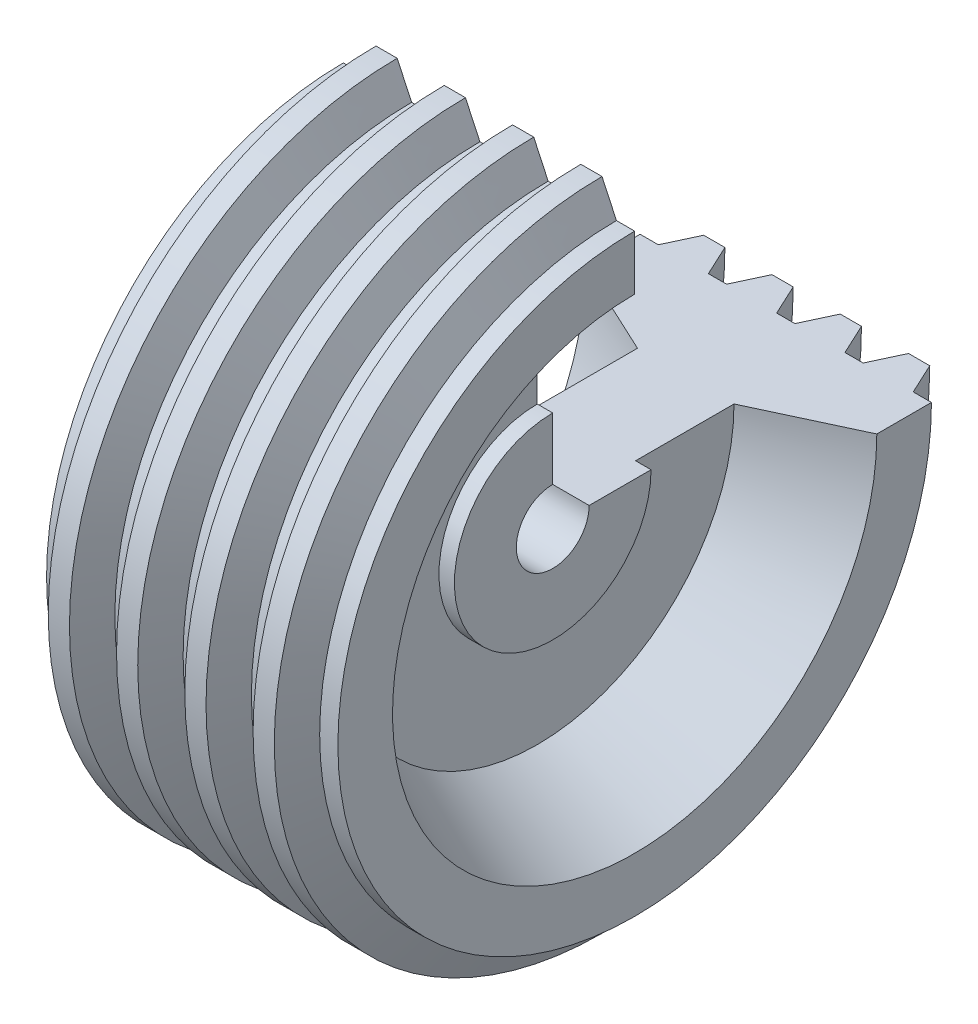
ISO-10303-21;
HEADER;
FILE_DESCRIPTION(('STEP AP214'),'2;1');
FILE_NAME('part.step','',(''),(''),'','','');
FILE_SCHEMA(('AUTOMOTIVE_DESIGN { 1 0 10303 214 1 1 1 1 }'));
ENDSEC;
DATA;
#1=APPLICATION_CONTEXT('core data for automotive mechanical design processes');
#2=APPLICATION_PROTOCOL_DEFINITION('international standard','automotive_design',2000,#1);
#3=PRODUCT_CONTEXT('',#1,'mechanical');
#4=PRODUCT('Part','Part','',(#3));
#5=PRODUCT_RELATED_PRODUCT_CATEGORY('part','',(#4));
#6=PRODUCT_DEFINITION_FORMATION('','',#4);
#7=PRODUCT_DEFINITION_CONTEXT('part definition',#1,'design');
#8=PRODUCT_DEFINITION('design','',#6,#7);
#9=PRODUCT_DEFINITION_SHAPE('','',#8);
#10=(LENGTH_UNIT() NAMED_UNIT(*) SI_UNIT(.MILLI.,.METRE.));
#11=(NAMED_UNIT(*) PLANE_ANGLE_UNIT() SI_UNIT($,.RADIAN.));
#12=(NAMED_UNIT(*) SI_UNIT($,.STERADIAN.) SOLID_ANGLE_UNIT());
#13=UNCERTAINTY_MEASURE_WITH_UNIT(LENGTH_MEASURE(1.E-05),#10,'distance_accuracy_value','');
#14=(GEOMETRIC_REPRESENTATION_CONTEXT(3) GLOBAL_UNCERTAINTY_ASSIGNED_CONTEXT((#13)) GLOBAL_UNIT_ASSIGNED_CONTEXT((#10,
#11,#12)) REPRESENTATION_CONTEXT('',''));
#15=CARTESIAN_POINT('',(0.,0.,0.));
#16=DIRECTION('',(0.,0.,1.));
#17=DIRECTION('',(1.,0.,0.));
#18=AXIS2_PLACEMENT_3D('',#15,#16,#17);
#19=CARTESIAN_POINT('',(-35.,2.09488880330588E-13,-20.));
#20=DIRECTION('',(1.,0.,0.));
#21=DIRECTION('',(0.,0.,-1.));
#22=AXIS2_PLACEMENT_3D('',#19,#20,#21);
#23=PLANE('',#22);
#24=CARTESIAN_POINT('',(-35.,0.,0.));
#25=DIRECTION('',(-1.,0.,0.));
#26=DIRECTION('',(0.,0.,1.));
#27=AXIS2_PLACEMENT_3D('',#24,#25,#26);
#28=CIRCLE('',#27,54.);
#29=CARTESIAN_POINT('',(-35.,5.65619976892588E-13,-54.));
#30=VERTEX_POINT('',#29);
#31=CARTESIAN_POINT('',(-35.,54.,0.));
#32=VERTEX_POINT('',#31);
#33=EDGE_CURVE('E11',#30,#32,#28,.T.);
#34=ORIENTED_EDGE('',*,*,#33,.T.);
#35=DIRECTION('',(0.,-1.,0.));
#36=VECTOR('',#35,1.);
#37=CARTESIAN_POINT('',(-35.,20.,0.));
#38=LINE('',#37,#36);
#39=CARTESIAN_POINT('',(-35.,20.,0.));
#40=VERTEX_POINT('',#39);
#41=EDGE_CURVE('E239',#32,#40,#38,.T.);
#42=ORIENTED_EDGE('',*,*,#41,.T.);
#43=CARTESIAN_POINT('',(-35.,0.,0.));
#44=DIRECTION('',(-1.,0.,0.));
#45=DIRECTION('',(0.,0.,1.));
#46=AXIS2_PLACEMENT_3D('',#43,#44,#45);
#47=CIRCLE('',#46,20.);
#48=CARTESIAN_POINT('',(-35.,2.09488880330588E-13,-20.));
#49=VERTEX_POINT('',#48);
#50=EDGE_CURVE('E221',#49,#40,#47,.T.);
#51=ORIENTED_EDGE('',*,*,#50,.F.);
#52=DIRECTION('',(0.,0.,1.));
#53=VECTOR('',#52,1.);
#54=CARTESIAN_POINT('',(-35.,2.09488880330588E-13,-20.));
#55=LINE('',#54,#53);
#56=EDGE_CURVE('E320',#30,#49,#55,.T.);
#57=ORIENTED_EDGE('',*,*,#56,.F.);
#58=EDGE_LOOP('',(#34,#42,#51,#57));
#59=FACE_BOUND('',#58,.T.);
#60=ADVANCED_FACE('F37',(#59),#23,.F.);
#61=CARTESIAN_POINT('',(0.,0.,0.));
#62=DIRECTION('',(-1.,0.,0.));
#63=DIRECTION('',(0.,0.,1.));
#64=AXIS2_PLACEMENT_3D('',#61,#62,#63);
#65=CYLINDRICAL_SURFACE('',#64,54.);
#66=CARTESIAN_POINT('',(-26.5,0.,0.));
#67=DIRECTION('',(-1.,0.,0.));
#68=DIRECTION('',(0.,0.,1.));
#69=AXIS2_PLACEMENT_3D('',#66,#67,#68);
#70=CIRCLE('',#69,54.);
#71=CARTESIAN_POINT('',(-26.5,5.65619976892588E-13,-54.));
#72=VERTEX_POINT('',#71);
#73=CARTESIAN_POINT('',(-26.5,54.,0.));
#74=VERTEX_POINT('',#73);
#75=EDGE_CURVE('E45',#72,#74,#70,.T.);
#76=ORIENTED_EDGE('',*,*,#75,.T.);
#77=DIRECTION('',(-1.,0.,0.));
#78=VECTOR('',#77,1.);
#79=CARTESIAN_POINT('',(-35.,54.,0.));
#80=LINE('',#79,#78);
#81=EDGE_CURVE('E318',#74,#32,#80,.T.);
#82=ORIENTED_EDGE('',*,*,#81,.T.);
#83=ORIENTED_EDGE('',*,*,#33,.F.);
#84=DIRECTION('',(-1.,0.,0.));
#85=VECTOR('',#84,1.);
#86=CARTESIAN_POINT('',(-35.,5.65619976892588E-13,-54.));
#87=LINE('',#86,#85);
#88=EDGE_CURVE('E233',#72,#30,#87,.T.);
#89=ORIENTED_EDGE('',*,*,#88,.F.);
#90=EDGE_LOOP('',(#76,#82,#83,#89));
#91=FACE_BOUND('',#90,.T.);
#92=ADVANCED_FACE('F39',(#91),#65,.T.);
#93=CARTESIAN_POINT('',(-26.5,5.65619976892588E-13,-54.));
#94=DIRECTION('',(1.,0.,0.));
#95=DIRECTION('',(0.,0.,-1.));
#96=AXIS2_PLACEMENT_3D('',#93,#94,#95);
#97=PLANE('',#96);
#98=CARTESIAN_POINT('',(-26.5,0.,0.));
#99=DIRECTION('',(-1.,0.,0.));
#100=DIRECTION('',(0.,0.,1.));
#101=AXIS2_PLACEMENT_3D('',#98,#99,#100);
#102=CIRCLE('',#101,108.052540288708);
#103=CARTESIAN_POINT('',(-26.5,1.13179028409786E-12,-108.052540288708));
#104=VERTEX_POINT('',#103);
#105=CARTESIAN_POINT('',(-26.5,108.052540288708,0.));
#106=VERTEX_POINT('',#105);
#107=EDGE_CURVE('E445',#104,#106,#102,.T.);
#108=ORIENTED_EDGE('',*,*,#107,.T.);
#109=DIRECTION('',(0.,-1.,0.));
#110=VECTOR('',#109,1.);
#111=CARTESIAN_POINT('',(-26.5,54.,0.));
#112=LINE('',#111,#110);
#113=EDGE_CURVE('E316',#106,#74,#112,.T.);
#114=ORIENTED_EDGE('',*,*,#113,.T.);
#115=ORIENTED_EDGE('',*,*,#75,.F.);
#116=DIRECTION('',(0.,0.,1.));
#117=VECTOR('',#116,1.);
#118=CARTESIAN_POINT('',(-26.5,5.65619976892588E-13,-54.));
#119=LINE('',#118,#117);
#120=EDGE_CURVE('E395',#104,#72,#119,.T.);
#121=ORIENTED_EDGE('',*,*,#120,.F.);
#122=EDGE_LOOP('',(#108,#114,#115,#121));
#123=FACE_BOUND('',#122,.T.);
#124=ADVANCED_FACE('F447',(#123),#97,.F.);
#125=CARTESIAN_POINT('',(-80.,0.,0.));
#126=DIRECTION('',(-1.,0.,0.));
#127=DIRECTION('',(0.,0.,1.));
#128=AXIS2_PLACEMENT_3D('',#125,#126,#127);
#129=CONICAL_SURFACE('',#128,133.,0.43633231299858);
#130=CARTESIAN_POINT('',(-80.,0.,0.));
#131=DIRECTION('',(-1.,0.,0.));
#132=DIRECTION('',(0.,0.,1.));
#133=AXIS2_PLACEMENT_3D('',#130,#131,#132);
#134=CIRCLE('',#133,133.);
#135=CARTESIAN_POINT('',(-80.,1.39310105419841E-12,-133.));
#136=VERTEX_POINT('',#135);
#137=CARTESIAN_POINT('',(-80.,133.,0.));
#138=VERTEX_POINT('',#137);
#139=EDGE_CURVE('E443',#136,#138,#134,.T.);
#140=ORIENTED_EDGE('',*,*,#139,.T.);
#141=DIRECTION('',(0.906307787036651,-0.422618261740697,0.));
#142=VECTOR('',#141,1.);
#143=CARTESIAN_POINT('',(-26.5,108.052540288708,0.));
#144=LINE('',#143,#142);
#145=EDGE_CURVE('E313',#138,#106,#144,.T.);
#146=ORIENTED_EDGE('',*,*,#145,.T.);
#147=ORIENTED_EDGE('',*,*,#107,.F.);
#148=DIRECTION('',(0.906307787036651,0.,0.422618261740697));
#149=VECTOR('',#148,1.);
#150=CARTESIAN_POINT('',(-26.5,1.13179028409786E-12,-108.052540288708));
#151=LINE('',#150,#149);
#152=EDGE_CURVE('E392',#136,#104,#151,.T.);
#153=ORIENTED_EDGE('',*,*,#152,.F.);
#154=EDGE_LOOP('',(#140,#146,#147,#153));
#155=FACE_BOUND('',#154,.T.);
#156=ADVANCED_FACE('F452',(#155),#129,.F.);
#157=CARTESIAN_POINT('',(-80.,1.39310105419841E-12,-133.));
#158=DIRECTION('',(1.,0.,0.));
#159=DIRECTION('',(0.,0.,-1.));
#160=AXIS2_PLACEMENT_3D('',#157,#158,#159);
#161=PLANE('',#160);
#162=CARTESIAN_POINT('',(-80.,0.,0.));
#163=DIRECTION('',(-1.,0.,0.));
#164=DIRECTION('',(0.,0.,1.));
#165=AXIS2_PLACEMENT_3D('',#162,#163,#164);
#166=CIRCLE('',#165,163.);
#167=CARTESIAN_POINT('',(-80.,1.70733437469429E-12,-163.));
#168=VERTEX_POINT('',#167);
#169=CARTESIAN_POINT('',(-80.,163.,0.));
#170=VERTEX_POINT('',#169);
#171=EDGE_CURVE('E441',#168,#170,#166,.T.);
#172=ORIENTED_EDGE('',*,*,#171,.T.);
#173=DIRECTION('',(0.,-1.,0.));
#174=VECTOR('',#173,1.);
#175=CARTESIAN_POINT('',(-80.,133.,0.));
#176=LINE('',#175,#174);
#177=EDGE_CURVE('E310',#170,#138,#176,.T.);
#178=ORIENTED_EDGE('',*,*,#177,.T.);
#179=ORIENTED_EDGE('',*,*,#139,.F.);
#180=DIRECTION('',(0.,0.,1.));
#181=VECTOR('',#180,1.);
#182=CARTESIAN_POINT('',(-80.,1.39310105419841E-12,-133.));
#183=LINE('',#182,#181);
#184=EDGE_CURVE('E389',#168,#136,#183,.T.);
#185=ORIENTED_EDGE('',*,*,#184,.F.);
#186=EDGE_LOOP('',(#172,#178,#179,#185));
#187=FACE_BOUND('',#186,.T.);
#188=ADVANCED_FACE('F456',(#187),#161,.F.);
#189=CARTESIAN_POINT('',(0.,0.,0.));
#190=DIRECTION('',(-1.,0.,0.));
#191=DIRECTION('',(0.,0.,1.));
#192=AXIS2_PLACEMENT_3D('',#189,#190,#191);
#193=CYLINDRICAL_SURFACE('',#192,163.);
#194=CARTESIAN_POINT('',(-70.,0.,0.));
#195=DIRECTION('',(-1.,0.,0.));
#196=DIRECTION('',(0.,0.,1.));
#197=AXIS2_PLACEMENT_3D('',#194,#195,#196);
#198=CIRCLE('',#197,163.);
#199=CARTESIAN_POINT('',(-70.,1.70733437469429E-12,-163.));
#200=VERTEX_POINT('',#199);
#201=CARTESIAN_POINT('',(-70.,163.,0.));
#202=VERTEX_POINT('',#201);
#203=EDGE_CURVE('E439',#200,#202,#198,.T.);
#204=ORIENTED_EDGE('',*,*,#203,.T.);
#205=DIRECTION('',(-1.,0.,0.));
#206=VECTOR('',#205,1.);
#207=CARTESIAN_POINT('',(-80.,163.,0.));
#208=LINE('',#207,#206);
#209=EDGE_CURVE('E307',#202,#170,#208,.T.);
#210=ORIENTED_EDGE('',*,*,#209,.T.);
#211=ORIENTED_EDGE('',*,*,#171,.F.);
#212=DIRECTION('',(-1.,0.,0.));
#213=VECTOR('',#212,1.);
#214=CARTESIAN_POINT('',(-80.,1.70733437469429E-12,-163.));
#215=LINE('',#214,#213);
#216=EDGE_CURVE('E386',#200,#168,#215,.T.);
#217=ORIENTED_EDGE('',*,*,#216,.F.);
#218=EDGE_LOOP('',(#204,#210,#211,#217));
#219=FACE_BOUND('',#218,.T.);
#220=ADVANCED_FACE('F459',(#219),#193,.T.);
#221=CARTESIAN_POINT('',(-62.0727698113651,0.,0.));
#222=DIRECTION('',(1.,0.,0.));
#223=DIRECTION('',(0.,0.,-1.));
#224=AXIS2_PLACEMENT_3D('',#221,#222,#223);
#225=CONICAL_SURFACE('',#224,180.,1.13446401379632);
#226=CARTESIAN_POINT('',(-62.0727698113651,0.,0.));
#227=DIRECTION('',(-1.,0.,0.));
#228=DIRECTION('',(0.,0.,1.));
#229=AXIS2_PLACEMENT_3D('',#226,#227,#228);
#230=CIRCLE('',#229,180.);
#231=CARTESIAN_POINT('',(-62.0727698113651,1.88539992297529E-12,-180.));
#232=VERTEX_POINT('',#231);
#233=CARTESIAN_POINT('',(-62.0727698113651,180.,0.));
#234=VERTEX_POINT('',#233);
#235=EDGE_CURVE('E437',#232,#234,#230,.T.);
#236=ORIENTED_EDGE('',*,*,#235,.T.);
#237=DIRECTION('',(-0.422618261740697,-0.906307787036651,0.));
#238=VECTOR('',#237,1.);
#239=CARTESIAN_POINT('',(-70.,163.,0.));
#240=LINE('',#239,#238);
#241=EDGE_CURVE('E304',#234,#202,#240,.T.);
#242=ORIENTED_EDGE('',*,*,#241,.T.);
#243=ORIENTED_EDGE('',*,*,#203,.F.);
#244=DIRECTION('',(-0.422618261740697,0.,0.906307787036651));
#245=VECTOR('',#244,1.);
#246=CARTESIAN_POINT('',(-70.,1.70733437469429E-12,-163.));
#247=LINE('',#246,#245);
#248=EDGE_CURVE('E383',#232,#200,#247,.T.);
#249=ORIENTED_EDGE('',*,*,#248,.F.);
#250=EDGE_LOOP('',(#236,#242,#243,#249));
#251=FACE_BOUND('',#250,.T.);
#252=ADVANCED_FACE('F464',(#251),#225,.T.);
#253=CARTESIAN_POINT('',(0.,0.,0.));
#254=DIRECTION('',(-1.,0.,0.));
#255=DIRECTION('',(0.,0.,1.));
#256=AXIS2_PLACEMENT_3D('',#253,#254,#255);
#257=CYLINDRICAL_SURFACE('',#256,180.);
#258=CARTESIAN_POINT('',(-50.4272301886349,0.,0.));
#259=DIRECTION('',(-1.,0.,0.));
#260=DIRECTION('',(0.,0.,1.));
#261=AXIS2_PLACEMENT_3D('',#258,#259,#260);
#262=CIRCLE('',#261,180.);
#263=CARTESIAN_POINT('',(-50.4272301886349,1.88539992297529E-12,-180.));
#264=VERTEX_POINT('',#263);
#265=CARTESIAN_POINT('',(-50.4272301886349,180.,0.));
#266=VERTEX_POINT('',#265);
#267=EDGE_CURVE('E435',#264,#266,#262,.T.);
#268=ORIENTED_EDGE('',*,*,#267,.T.);
#269=DIRECTION('',(-1.,0.,0.));
#270=VECTOR('',#269,1.);
#271=CARTESIAN_POINT('',(-62.0727698113651,180.,0.));
#272=LINE('',#271,#270);
#273=EDGE_CURVE('E301',#266,#234,#272,.T.);
#274=ORIENTED_EDGE('',*,*,#273,.T.);
#275=ORIENTED_EDGE('',*,*,#235,.F.);
#276=DIRECTION('',(-1.,0.,0.));
#277=VECTOR('',#276,1.);
#278=CARTESIAN_POINT('',(-62.0727698113651,1.88539992297529E-12,-180.));
#279=LINE('',#278,#277);
#280=EDGE_CURVE('E380',#264,#232,#279,.T.);
#281=ORIENTED_EDGE('',*,*,#280,.F.);
#282=EDGE_LOOP('',(#268,#274,#275,#281));
#283=FACE_BOUND('',#282,.T.);
#284=ADVANCED_FACE('F468',(#283),#257,.T.);
#285=CARTESIAN_POINT('',(-42.5,0.,0.));
#286=DIRECTION('',(-1.,0.,0.));
#287=DIRECTION('',(0.,0.,1.));
#288=AXIS2_PLACEMENT_3D('',#285,#286,#287);
#289=CONICAL_SURFACE('',#288,163.,1.13446401379632);
#290=CARTESIAN_POINT('',(-42.5,0.,0.));
#291=DIRECTION('',(-1.,0.,0.));
#292=DIRECTION('',(0.,0.,1.));
#293=AXIS2_PLACEMENT_3D('',#290,#291,#292);
#294=CIRCLE('',#293,163.);
#295=CARTESIAN_POINT('',(-42.5,1.70733437469429E-12,-163.));
#296=VERTEX_POINT('',#295);
#297=CARTESIAN_POINT('',(-42.5,163.,0.));
#298=VERTEX_POINT('',#297);
#299=EDGE_CURVE('E433',#296,#298,#294,.T.);
#300=ORIENTED_EDGE('',*,*,#299,.T.);
#301=DIRECTION('',(-0.422618261740697,0.906307787036651,0.));
#302=VECTOR('',#301,1.);
#303=CARTESIAN_POINT('',(-50.4272301886349,180.,0.));
#304=LINE('',#303,#302);
#305=EDGE_CURVE('E298',#298,#266,#304,.T.);
#306=ORIENTED_EDGE('',*,*,#305,.T.);
#307=ORIENTED_EDGE('',*,*,#267,.F.);
#308=DIRECTION('',(-0.422618261740697,0.,-0.906307787036651));
#309=VECTOR('',#308,1.);
#310=CARTESIAN_POINT('',(-50.4272301886349,1.88539992297529E-12,-180.));
#311=LINE('',#310,#309);
#312=EDGE_CURVE('E377',#296,#264,#311,.T.);
#313=ORIENTED_EDGE('',*,*,#312,.F.);
#314=EDGE_LOOP('',(#300,#306,#307,#313));
#315=FACE_BOUND('',#314,.T.);
#316=ADVANCED_FACE('F471',(#315),#289,.T.);
#317=CARTESIAN_POINT('',(0.,0.,0.));
#318=DIRECTION('',(-1.,0.,0.));
#319=DIRECTION('',(0.,0.,1.));
#320=AXIS2_PLACEMENT_3D('',#317,#318,#319);
#321=CYLINDRICAL_SURFACE('',#320,163.);
#322=CARTESIAN_POINT('',(-32.5,0.,0.));
#323=DIRECTION('',(-1.,0.,0.));
#324=DIRECTION('',(0.,0.,1.));
#325=AXIS2_PLACEMENT_3D('',#322,#323,#324);
#326=CIRCLE('',#325,163.);
#327=CARTESIAN_POINT('',(-32.5,1.70733437469429E-12,-163.));
#328=VERTEX_POINT('',#327);
#329=CARTESIAN_POINT('',(-32.5,163.,0.));
#330=VERTEX_POINT('',#329);
#331=EDGE_CURVE('E431',#328,#330,#326,.T.);
#332=ORIENTED_EDGE('',*,*,#331,.T.);
#333=DIRECTION('',(-1.,0.,0.));
#334=VECTOR('',#333,1.);
#335=CARTESIAN_POINT('',(-42.5,163.,0.));
#336=LINE('',#335,#334);
#337=EDGE_CURVE('E295',#330,#298,#336,.T.);
#338=ORIENTED_EDGE('',*,*,#337,.T.);
#339=ORIENTED_EDGE('',*,*,#299,.F.);
#340=DIRECTION('',(-1.,0.,0.));
#341=VECTOR('',#340,1.);
#342=CARTESIAN_POINT('',(-42.5,1.70733437469429E-12,-163.));
#343=LINE('',#342,#341);
#344=EDGE_CURVE('E374',#328,#296,#343,.T.);
#345=ORIENTED_EDGE('',*,*,#344,.F.);
#346=EDGE_LOOP('',(#332,#338,#339,#345));
#347=FACE_BOUND('',#346,.T.);
#348=ADVANCED_FACE('F476',(#347),#321,.T.);
#349=CARTESIAN_POINT('',(-24.5727698113651,0.,0.));
#350=DIRECTION('',(1.,0.,0.));
#351=DIRECTION('',(0.,0.,-1.));
#352=AXIS2_PLACEMENT_3D('',#349,#350,#351);
#353=CONICAL_SURFACE('',#352,180.,1.13446401379632);
#354=CARTESIAN_POINT('',(-24.5727698113651,0.,0.));
#355=DIRECTION('',(-1.,0.,0.));
#356=DIRECTION('',(0.,0.,1.));
#357=AXIS2_PLACEMENT_3D('',#354,#355,#356);
#358=CIRCLE('',#357,180.);
#359=CARTESIAN_POINT('',(-24.5727698113651,1.88539992297529E-12,-180.));
#360=VERTEX_POINT('',#359);
#361=CARTESIAN_POINT('',(-24.5727698113651,180.,0.));
#362=VERTEX_POINT('',#361);
#363=EDGE_CURVE('E429',#360,#362,#358,.T.);
#364=ORIENTED_EDGE('',*,*,#363,.T.);
#365=DIRECTION('',(-0.422618261740697,-0.906307787036651,0.));
#366=VECTOR('',#365,1.);
#367=CARTESIAN_POINT('',(-32.5,163.,0.));
#368=LINE('',#367,#366);
#369=EDGE_CURVE('E292',#362,#330,#368,.T.);
#370=ORIENTED_EDGE('',*,*,#369,.T.);
#371=ORIENTED_EDGE('',*,*,#331,.F.);
#372=DIRECTION('',(-0.422618261740697,0.,0.906307787036651));
#373=VECTOR('',#372,1.);
#374=CARTESIAN_POINT('',(-32.5,1.70733437469429E-12,-163.));
#375=LINE('',#374,#373);
#376=EDGE_CURVE('E371',#360,#328,#375,.T.);
#377=ORIENTED_EDGE('',*,*,#376,.F.);
#378=EDGE_LOOP('',(#364,#370,#371,#377));
#379=FACE_BOUND('',#378,.T.);
#380=ADVANCED_FACE('F480',(#379),#353,.T.);
#381=CARTESIAN_POINT('',(0.,0.,0.));
#382=DIRECTION('',(-1.,0.,0.));
#383=DIRECTION('',(0.,0.,1.));
#384=AXIS2_PLACEMENT_3D('',#381,#382,#383);
#385=CYLINDRICAL_SURFACE('',#384,180.);
#386=CARTESIAN_POINT('',(-12.9272301886349,0.,0.));
#387=DIRECTION('',(-1.,0.,0.));
#388=DIRECTION('',(0.,0.,1.));
#389=AXIS2_PLACEMENT_3D('',#386,#387,#388);
#390=CIRCLE('',#389,180.);
#391=CARTESIAN_POINT('',(-12.9272301886349,1.88539992297529E-12,-180.));
#392=VERTEX_POINT('',#391);
#393=CARTESIAN_POINT('',(-12.9272301886349,180.,0.));
#394=VERTEX_POINT('',#393);
#395=EDGE_CURVE('E427',#392,#394,#390,.T.);
#396=ORIENTED_EDGE('',*,*,#395,.T.);
#397=DIRECTION('',(-1.,0.,0.));
#398=VECTOR('',#397,1.);
#399=CARTESIAN_POINT('',(-24.5727698113651,180.,0.));
#400=LINE('',#399,#398);
#401=EDGE_CURVE('E289',#394,#362,#400,.T.);
#402=ORIENTED_EDGE('',*,*,#401,.T.);
#403=ORIENTED_EDGE('',*,*,#363,.F.);
#404=DIRECTION('',(-1.,0.,0.));
#405=VECTOR('',#404,1.);
#406=CARTESIAN_POINT('',(-24.5727698113651,1.88539992297529E-12,-180.));
#407=LINE('',#406,#405);
#408=EDGE_CURVE('E368',#392,#360,#407,.T.);
#409=ORIENTED_EDGE('',*,*,#408,.F.);
#410=EDGE_LOOP('',(#396,#402,#403,#409));
#411=FACE_BOUND('',#410,.T.);
#412=ADVANCED_FACE('F483',(#411),#385,.T.);
#413=CARTESIAN_POINT('',(-5.,0.,0.));
#414=DIRECTION('',(-1.,0.,0.));
#415=DIRECTION('',(0.,0.,1.));
#416=AXIS2_PLACEMENT_3D('',#413,#414,#415);
#417=CONICAL_SURFACE('',#416,163.,1.13446401379632);
#418=CARTESIAN_POINT('',(-5.,0.,0.));
#419=DIRECTION('',(-1.,0.,0.));
#420=DIRECTION('',(0.,0.,1.));
#421=AXIS2_PLACEMENT_3D('',#418,#419,#420);
#422=CIRCLE('',#421,163.);
#423=CARTESIAN_POINT('',(-5.,1.70733437469429E-12,-163.));
#424=VERTEX_POINT('',#423);
#425=CARTESIAN_POINT('',(-5.,163.,0.));
#426=VERTEX_POINT('',#425);
#427=EDGE_CURVE('E425',#424,#426,#422,.T.);
#428=ORIENTED_EDGE('',*,*,#427,.T.);
#429=DIRECTION('',(-0.422618261740697,0.906307787036651,0.));
#430=VECTOR('',#429,1.);
#431=CARTESIAN_POINT('',(-12.9272301886349,180.,0.));
#432=LINE('',#431,#430);
#433=EDGE_CURVE('E286',#426,#394,#432,.T.);
#434=ORIENTED_EDGE('',*,*,#433,.T.);
#435=ORIENTED_EDGE('',*,*,#395,.F.);
#436=DIRECTION('',(-0.422618261740697,0.,-0.906307787036651));
#437=VECTOR('',#436,1.);
#438=CARTESIAN_POINT('',(-12.9272301886349,1.88539992297529E-12,-180.));
#439=LINE('',#438,#437);
#440=EDGE_CURVE('E365',#424,#392,#439,.T.);
#441=ORIENTED_EDGE('',*,*,#440,.F.);
#442=EDGE_LOOP('',(#428,#434,#435,#441));
#443=FACE_BOUND('',#442,.T.);
#444=ADVANCED_FACE('F488',(#443),#417,.T.);
#445=CARTESIAN_POINT('',(0.,0.,0.));
#446=DIRECTION('',(-1.,0.,0.));
#447=DIRECTION('',(0.,0.,1.));
#448=AXIS2_PLACEMENT_3D('',#445,#446,#447);
#449=CYLINDRICAL_SURFACE('',#448,163.);
#450=CARTESIAN_POINT('',(5.,0.,0.));
#451=DIRECTION('',(-1.,0.,0.));
#452=DIRECTION('',(0.,0.,1.));
#453=AXIS2_PLACEMENT_3D('',#450,#451,#452);
#454=CIRCLE('',#453,163.);
#455=CARTESIAN_POINT('',(5.,1.70733437469429E-12,-163.));
#456=VERTEX_POINT('',#455);
#457=CARTESIAN_POINT('',(5.,163.,0.));
#458=VERTEX_POINT('',#457);
#459=EDGE_CURVE('E423',#456,#458,#454,.T.);
#460=ORIENTED_EDGE('',*,*,#459,.T.);
#461=DIRECTION('',(-1.,0.,0.));
#462=VECTOR('',#461,1.);
#463=CARTESIAN_POINT('',(-5.,163.,0.));
#464=LINE('',#463,#462);
#465=EDGE_CURVE('E283',#458,#426,#464,.T.);
#466=ORIENTED_EDGE('',*,*,#465,.T.);
#467=ORIENTED_EDGE('',*,*,#427,.F.);
#468=DIRECTION('',(-1.,0.,0.));
#469=VECTOR('',#468,1.);
#470=CARTESIAN_POINT('',(-5.,1.70733437469429E-12,-163.));
#471=LINE('',#470,#469);
#472=EDGE_CURVE('E362',#456,#424,#471,.T.);
#473=ORIENTED_EDGE('',*,*,#472,.F.);
#474=EDGE_LOOP('',(#460,#466,#467,#473));
#475=FACE_BOUND('',#474,.T.);
#476=ADVANCED_FACE('F492',(#475),#449,.T.);
#477=CARTESIAN_POINT('',(12.9272301886349,0.,0.));
#478=DIRECTION('',(1.,0.,0.));
#479=DIRECTION('',(0.,0.,-1.));
#480=AXIS2_PLACEMENT_3D('',#477,#478,#479);
#481=CONICAL_SURFACE('',#480,180.,1.13446401379632);
#482=CARTESIAN_POINT('',(12.9272301886349,0.,0.));
#483=DIRECTION('',(-1.,0.,0.));
#484=DIRECTION('',(0.,0.,1.));
#485=AXIS2_PLACEMENT_3D('',#482,#483,#484);
#486=CIRCLE('',#485,180.);
#487=CARTESIAN_POINT('',(12.9272301886349,1.88539992297529E-12,-180.));
#488=VERTEX_POINT('',#487);
#489=CARTESIAN_POINT('',(12.9272301886349,180.,0.));
#490=VERTEX_POINT('',#489);
#491=EDGE_CURVE('E421',#488,#490,#486,.T.);
#492=ORIENTED_EDGE('',*,*,#491,.T.);
#493=DIRECTION('',(-0.422618261740697,-0.906307787036651,0.));
#494=VECTOR('',#493,1.);
#495=CARTESIAN_POINT('',(12.9272301886349,180.,0.));
#496=LINE('',#495,#494);
#497=EDGE_CURVE('E280',#490,#458,#496,.T.);
#498=ORIENTED_EDGE('',*,*,#497,.T.);
#499=ORIENTED_EDGE('',*,*,#459,.F.);
#500=DIRECTION('',(-0.422618261740697,0.,0.906307787036651));
#501=VECTOR('',#500,1.);
#502=CARTESIAN_POINT('',(12.9272301886349,1.88539992297529E-12,-180.));
#503=LINE('',#502,#501);
#504=EDGE_CURVE('E359',#488,#456,#503,.T.);
#505=ORIENTED_EDGE('',*,*,#504,.F.);
#506=EDGE_LOOP('',(#492,#498,#499,#505));
#507=FACE_BOUND('',#506,.T.);
#508=ADVANCED_FACE('F495',(#507),#481,.T.);
#509=CARTESIAN_POINT('',(0.,0.,0.));
#510=DIRECTION('',(-1.,0.,0.));
#511=DIRECTION('',(0.,0.,1.));
#512=AXIS2_PLACEMENT_3D('',#509,#510,#511);
#513=CYLINDRICAL_SURFACE('',#512,180.);
#514=CARTESIAN_POINT('',(24.5727698113651,0.,0.));
#515=DIRECTION('',(-1.,0.,0.));
#516=DIRECTION('',(0.,0.,1.));
#517=AXIS2_PLACEMENT_3D('',#514,#515,#516);
#518=CIRCLE('',#517,180.);
#519=CARTESIAN_POINT('',(24.5727698113651,1.88539992297529E-12,-180.));
#520=VERTEX_POINT('',#519);
#521=CARTESIAN_POINT('',(24.5727698113651,180.,0.));
#522=VERTEX_POINT('',#521);
#523=EDGE_CURVE('E419',#520,#522,#518,.T.);
#524=ORIENTED_EDGE('',*,*,#523,.T.);
#525=DIRECTION('',(-1.,0.,0.));
#526=VECTOR('',#525,1.);
#527=CARTESIAN_POINT('',(24.5727698113651,180.,0.));
#528=LINE('',#527,#526);
#529=EDGE_CURVE('E277',#522,#490,#528,.T.);
#530=ORIENTED_EDGE('',*,*,#529,.T.);
#531=ORIENTED_EDGE('',*,*,#491,.F.);
#532=DIRECTION('',(-1.,0.,0.));
#533=VECTOR('',#532,1.);
#534=CARTESIAN_POINT('',(24.5727698113651,1.88539992297529E-12,-180.));
#535=LINE('',#534,#533);
#536=EDGE_CURVE('E356',#520,#488,#535,.T.);
#537=ORIENTED_EDGE('',*,*,#536,.F.);
#538=EDGE_LOOP('',(#524,#530,#531,#537));
#539=FACE_BOUND('',#538,.T.);
#540=ADVANCED_FACE('F500',(#539),#513,.T.);
#541=CARTESIAN_POINT('',(32.5,0.,0.));
#542=DIRECTION('',(-1.,0.,0.));
#543=DIRECTION('',(0.,0.,1.));
#544=AXIS2_PLACEMENT_3D('',#541,#542,#543);
#545=CONICAL_SURFACE('',#544,163.,1.13446401379632);
#546=CARTESIAN_POINT('',(32.5,0.,0.));
#547=DIRECTION('',(-1.,0.,0.));
#548=DIRECTION('',(0.,0.,1.));
#549=AXIS2_PLACEMENT_3D('',#546,#547,#548);
#550=CIRCLE('',#549,163.);
#551=CARTESIAN_POINT('',(32.5,1.70733437469429E-12,-163.));
#552=VERTEX_POINT('',#551);
#553=CARTESIAN_POINT('',(32.5,163.,0.));
#554=VERTEX_POINT('',#553);
#555=EDGE_CURVE('E417',#552,#554,#550,.T.);
#556=ORIENTED_EDGE('',*,*,#555,.T.);
#557=DIRECTION('',(-0.422618261740697,0.906307787036651,0.));
#558=VECTOR('',#557,1.);
#559=CARTESIAN_POINT('',(32.5,163.,0.));
#560=LINE('',#559,#558);
#561=EDGE_CURVE('E274',#554,#522,#560,.T.);
#562=ORIENTED_EDGE('',*,*,#561,.T.);
#563=ORIENTED_EDGE('',*,*,#523,.F.);
#564=DIRECTION('',(-0.422618261740697,0.,-0.906307787036651));
#565=VECTOR('',#564,1.);
#566=CARTESIAN_POINT('',(32.5,1.70733437469429E-12,-163.));
#567=LINE('',#566,#565);
#568=EDGE_CURVE('E353',#552,#520,#567,.T.);
#569=ORIENTED_EDGE('',*,*,#568,.F.);
#570=EDGE_LOOP('',(#556,#562,#563,#569));
#571=FACE_BOUND('',#570,.T.);
#572=ADVANCED_FACE('F504',(#571),#545,.T.);
#573=CARTESIAN_POINT('',(0.,0.,0.));
#574=DIRECTION('',(-1.,0.,0.));
#575=DIRECTION('',(0.,0.,1.));
#576=AXIS2_PLACEMENT_3D('',#573,#574,#575);
#577=CYLINDRICAL_SURFACE('',#576,163.);
#578=CARTESIAN_POINT('',(42.5,0.,0.));
#579=DIRECTION('',(-1.,0.,0.));
#580=DIRECTION('',(0.,0.,1.));
#581=AXIS2_PLACEMENT_3D('',#578,#579,#580);
#582=CIRCLE('',#581,163.);
#583=CARTESIAN_POINT('',(42.5,1.70733437469429E-12,-163.));
#584=VERTEX_POINT('',#583);
#585=CARTESIAN_POINT('',(42.5,163.,0.));
#586=VERTEX_POINT('',#585);
#587=EDGE_CURVE('E415',#584,#586,#582,.T.);
#588=ORIENTED_EDGE('',*,*,#587,.T.);
#589=DIRECTION('',(-1.,0.,0.));
#590=VECTOR('',#589,1.);
#591=CARTESIAN_POINT('',(42.5,163.,0.));
#592=LINE('',#591,#590);
#593=EDGE_CURVE('E271',#586,#554,#592,.T.);
#594=ORIENTED_EDGE('',*,*,#593,.T.);
#595=ORIENTED_EDGE('',*,*,#555,.F.);
#596=DIRECTION('',(-1.,0.,0.));
#597=VECTOR('',#596,1.);
#598=CARTESIAN_POINT('',(42.5,1.70733437469429E-12,-163.));
#599=LINE('',#598,#597);
#600=EDGE_CURVE('E350',#584,#552,#599,.T.);
#601=ORIENTED_EDGE('',*,*,#600,.F.);
#602=EDGE_LOOP('',(#588,#594,#595,#601));
#603=FACE_BOUND('',#602,.T.);
#604=ADVANCED_FACE('F507',(#603),#577,.T.);
#605=CARTESIAN_POINT('',(50.4272301886349,0.,0.));
#606=DIRECTION('',(1.,0.,0.));
#607=DIRECTION('',(0.,0.,-1.));
#608=AXIS2_PLACEMENT_3D('',#605,#606,#607);
#609=CONICAL_SURFACE('',#608,180.,1.13446401379632);
#610=CARTESIAN_POINT('',(50.4272301886349,0.,0.));
#611=DIRECTION('',(-1.,0.,0.));
#612=DIRECTION('',(0.,0.,1.));
#613=AXIS2_PLACEMENT_3D('',#610,#611,#612);
#614=CIRCLE('',#613,180.);
#615=CARTESIAN_POINT('',(50.4272301886349,1.88539992297529E-12,-180.));
#616=VERTEX_POINT('',#615);
#617=CARTESIAN_POINT('',(50.4272301886349,180.,0.));
#618=VERTEX_POINT('',#617);
#619=EDGE_CURVE('E413',#616,#618,#614,.T.);
#620=ORIENTED_EDGE('',*,*,#619,.T.);
#621=DIRECTION('',(-0.422618261740697,-0.906307787036651,0.));
#622=VECTOR('',#621,1.);
#623=CARTESIAN_POINT('',(50.4272301886349,180.,0.));
#624=LINE('',#623,#622);
#625=EDGE_CURVE('E268',#618,#586,#624,.T.);
#626=ORIENTED_EDGE('',*,*,#625,.T.);
#627=ORIENTED_EDGE('',*,*,#587,.F.);
#628=DIRECTION('',(-0.422618261740697,0.,0.906307787036651));
#629=VECTOR('',#628,1.);
#630=CARTESIAN_POINT('',(50.4272301886349,1.88539992297529E-12,-180.));
#631=LINE('',#630,#629);
#632=EDGE_CURVE('E347',#616,#584,#631,.T.);
#633=ORIENTED_EDGE('',*,*,#632,.F.);
#634=EDGE_LOOP('',(#620,#626,#627,#633));
#635=FACE_BOUND('',#634,.T.);
#636=ADVANCED_FACE('F512',(#635),#609,.T.);
#637=CARTESIAN_POINT('',(0.,0.,0.));
#638=DIRECTION('',(-1.,0.,0.));
#639=DIRECTION('',(0.,0.,1.));
#640=AXIS2_PLACEMENT_3D('',#637,#638,#639);
#641=CYLINDRICAL_SURFACE('',#640,180.);
#642=CARTESIAN_POINT('',(62.0727698113651,0.,0.));
#643=DIRECTION('',(-1.,0.,0.));
#644=DIRECTION('',(0.,0.,1.));
#645=AXIS2_PLACEMENT_3D('',#642,#643,#644);
#646=CIRCLE('',#645,180.);
#647=CARTESIAN_POINT('',(62.0727698113651,1.88539992297529E-12,-180.));
#648=VERTEX_POINT('',#647);
#649=CARTESIAN_POINT('',(62.0727698113651,180.,0.));
#650=VERTEX_POINT('',#649);
#651=EDGE_CURVE('E411',#648,#650,#646,.T.);
#652=ORIENTED_EDGE('',*,*,#651,.T.);
#653=DIRECTION('',(-1.,0.,0.));
#654=VECTOR('',#653,1.);
#655=CARTESIAN_POINT('',(62.0727698113651,180.,0.));
#656=LINE('',#655,#654);
#657=EDGE_CURVE('E265',#650,#618,#656,.T.);
#658=ORIENTED_EDGE('',*,*,#657,.T.);
#659=ORIENTED_EDGE('',*,*,#619,.F.);
#660=DIRECTION('',(-1.,0.,0.));
#661=VECTOR('',#660,1.);
#662=CARTESIAN_POINT('',(62.0727698113651,1.88539992297529E-12,-180.));
#663=LINE('',#662,#661);
#664=EDGE_CURVE('E344',#648,#616,#663,.T.);
#665=ORIENTED_EDGE('',*,*,#664,.F.);
#666=EDGE_LOOP('',(#652,#658,#659,#665));
#667=FACE_BOUND('',#666,.T.);
#668=ADVANCED_FACE('F516',(#667),#641,.T.);
#669=CARTESIAN_POINT('',(70.,0.,0.));
#670=DIRECTION('',(-1.,0.,0.));
#671=DIRECTION('',(0.,0.,1.));
#672=AXIS2_PLACEMENT_3D('',#669,#670,#671);
#673=CONICAL_SURFACE('',#672,163.,1.13446401379632);
#674=CARTESIAN_POINT('',(70.,0.,0.));
#675=DIRECTION('',(-1.,0.,0.));
#676=DIRECTION('',(0.,0.,1.));
#677=AXIS2_PLACEMENT_3D('',#674,#675,#676);
#678=CIRCLE('',#677,163.);
#679=CARTESIAN_POINT('',(70.,1.70733437469429E-12,-163.));
#680=VERTEX_POINT('',#679);
#681=CARTESIAN_POINT('',(70.,163.,0.));
#682=VERTEX_POINT('',#681);
#683=EDGE_CURVE('E409',#680,#682,#678,.T.);
#684=ORIENTED_EDGE('',*,*,#683,.T.);
#685=DIRECTION('',(-0.422618261740698,0.906307787036651,0.));
#686=VECTOR('',#685,1.);
#687=CARTESIAN_POINT('',(70.,163.,0.));
#688=LINE('',#687,#686);
#689=EDGE_CURVE('E262',#682,#650,#688,.T.);
#690=ORIENTED_EDGE('',*,*,#689,.T.);
#691=ORIENTED_EDGE('',*,*,#651,.F.);
#692=DIRECTION('',(-0.422618261740698,0.,-0.906307787036651));
#693=VECTOR('',#692,1.);
#694=CARTESIAN_POINT('',(70.,1.70733437469429E-12,-163.));
#695=LINE('',#694,#693);
#696=EDGE_CURVE('E341',#680,#648,#695,.T.);
#697=ORIENTED_EDGE('',*,*,#696,.F.);
#698=EDGE_LOOP('',(#684,#690,#691,#697));
#699=FACE_BOUND('',#698,.T.);
#700=ADVANCED_FACE('F519',(#699),#673,.T.);
#701=CARTESIAN_POINT('',(0.,0.,0.));
#702=DIRECTION('',(-1.,0.,0.));
#703=DIRECTION('',(0.,0.,1.));
#704=AXIS2_PLACEMENT_3D('',#701,#702,#703);
#705=CYLINDRICAL_SURFACE('',#704,163.);
#706=CARTESIAN_POINT('',(80.,0.,0.));
#707=DIRECTION('',(-1.,0.,0.));
#708=DIRECTION('',(0.,0.,1.));
#709=AXIS2_PLACEMENT_3D('',#706,#707,#708);
#710=CIRCLE('',#709,163.);
#711=CARTESIAN_POINT('',(80.,1.70733437469429E-12,-163.));
#712=VERTEX_POINT('',#711);
#713=CARTESIAN_POINT('',(80.,163.,0.));
#714=VERTEX_POINT('',#713);
#715=EDGE_CURVE('E407',#712,#714,#710,.T.);
#716=ORIENTED_EDGE('',*,*,#715,.T.);
#717=DIRECTION('',(-1.,0.,0.));
#718=VECTOR('',#717,1.);
#719=CARTESIAN_POINT('',(80.,163.,0.));
#720=LINE('',#719,#718);
#721=EDGE_CURVE('E259',#714,#682,#720,.T.);
#722=ORIENTED_EDGE('',*,*,#721,.T.);
#723=ORIENTED_EDGE('',*,*,#683,.F.);
#724=DIRECTION('',(-1.,0.,0.));
#725=VECTOR('',#724,1.);
#726=CARTESIAN_POINT('',(80.,1.70733437469429E-12,-163.));
#727=LINE('',#726,#725);
#728=EDGE_CURVE('E338',#712,#680,#727,.T.);
#729=ORIENTED_EDGE('',*,*,#728,.F.);
#730=EDGE_LOOP('',(#716,#722,#723,#729));
#731=FACE_BOUND('',#730,.T.);
#732=ADVANCED_FACE('F524',(#731),#705,.T.);
#733=CARTESIAN_POINT('',(80.,1.39310105419841E-12,-133.));
#734=DIRECTION('',(-1.,0.,0.));
#735=DIRECTION('',(0.,0.,1.));
#736=AXIS2_PLACEMENT_3D('',#733,#734,#735);
#737=PLANE('',#736);
#738=CARTESIAN_POINT('',(80.,0.,0.));
#739=DIRECTION('',(-1.,0.,0.));
#740=DIRECTION('',(0.,0.,1.));
#741=AXIS2_PLACEMENT_3D('',#738,#739,#740);
#742=CIRCLE('',#741,133.);
#743=CARTESIAN_POINT('',(80.,1.39310105419841E-12,-133.));
#744=VERTEX_POINT('',#743);
#745=CARTESIAN_POINT('',(80.,133.,0.));
#746=VERTEX_POINT('',#745);
#747=EDGE_CURVE('E405',#744,#746,#742,.T.);
#748=ORIENTED_EDGE('',*,*,#747,.T.);
#749=DIRECTION('',(0.,1.,0.));
#750=VECTOR('',#749,1.);
#751=CARTESIAN_POINT('',(80.,133.,0.));
#752=LINE('',#751,#750);
#753=EDGE_CURVE('E256',#746,#714,#752,.T.);
#754=ORIENTED_EDGE('',*,*,#753,.T.);
#755=ORIENTED_EDGE('',*,*,#715,.F.);
#756=DIRECTION('',(0.,0.,-1.));
#757=VECTOR('',#756,1.);
#758=CARTESIAN_POINT('',(80.,1.39310105419841E-12,-133.));
#759=LINE('',#758,#757);
#760=EDGE_CURVE('E335',#744,#712,#759,.T.);
#761=ORIENTED_EDGE('',*,*,#760,.F.);
#762=EDGE_LOOP('',(#748,#754,#755,#761));
#763=FACE_BOUND('',#762,.T.);
#764=ADVANCED_FACE('F528',(#763),#737,.F.);
#765=CARTESIAN_POINT('',(26.5,0.,0.));
#766=DIRECTION('',(1.,0.,0.));
#767=DIRECTION('',(0.,0.,-1.));
#768=AXIS2_PLACEMENT_3D('',#765,#766,#767);
#769=CONICAL_SURFACE('',#768,108.052540288708,0.43633231299858);
#770=CARTESIAN_POINT('',(26.5,0.,0.));
#771=DIRECTION('',(-1.,0.,0.));
#772=DIRECTION('',(0.,0.,1.));
#773=AXIS2_PLACEMENT_3D('',#770,#771,#772);
#774=CIRCLE('',#773,108.052540288708);
#775=CARTESIAN_POINT('',(26.5,1.13179028409786E-12,-108.052540288708));
#776=VERTEX_POINT('',#775);
#777=CARTESIAN_POINT('',(26.5,108.052540288708,0.));
#778=VERTEX_POINT('',#777);
#779=EDGE_CURVE('E403',#776,#778,#774,.T.);
#780=ORIENTED_EDGE('',*,*,#779,.T.);
#781=DIRECTION('',(0.906307787036651,0.422618261740697,0.));
#782=VECTOR('',#781,1.);
#783=CARTESIAN_POINT('',(26.5,108.052540288708,0.));
#784=LINE('',#783,#782);
#785=EDGE_CURVE('E253',#778,#746,#784,.T.);
#786=ORIENTED_EDGE('',*,*,#785,.T.);
#787=ORIENTED_EDGE('',*,*,#747,.F.);
#788=DIRECTION('',(0.906307787036651,0.,-0.422618261740697));
#789=VECTOR('',#788,1.);
#790=CARTESIAN_POINT('',(26.5,1.13179028409786E-12,-108.052540288708));
#791=LINE('',#790,#789);
#792=EDGE_CURVE('E332',#776,#744,#791,.T.);
#793=ORIENTED_EDGE('',*,*,#792,.F.);
#794=EDGE_LOOP('',(#780,#786,#787,#793));
#795=FACE_BOUND('',#794,.T.);
#796=ADVANCED_FACE('F531',(#795),#769,.F.);
#797=CARTESIAN_POINT('',(26.5,5.65619976892588E-13,-54.));
#798=DIRECTION('',(-1.,0.,0.));
#799=DIRECTION('',(0.,0.,1.));
#800=AXIS2_PLACEMENT_3D('',#797,#798,#799);
#801=PLANE('',#800);
#802=CARTESIAN_POINT('',(26.5,0.,0.));
#803=DIRECTION('',(-1.,0.,0.));
#804=DIRECTION('',(0.,0.,1.));
#805=AXIS2_PLACEMENT_3D('',#802,#803,#804);
#806=CIRCLE('',#805,54.);
#807=CARTESIAN_POINT('',(26.5,5.65619976892588E-13,-54.));
#808=VERTEX_POINT('',#807);
#809=CARTESIAN_POINT('',(26.5,54.,0.));
#810=VERTEX_POINT('',#809);
#811=EDGE_CURVE('E401',#808,#810,#806,.T.);
#812=ORIENTED_EDGE('',*,*,#811,.T.);
#813=DIRECTION('',(0.,1.,0.));
#814=VECTOR('',#813,1.);
#815=CARTESIAN_POINT('',(26.5,54.,0.));
#816=LINE('',#815,#814);
#817=EDGE_CURVE('E250',#810,#778,#816,.T.);
#818=ORIENTED_EDGE('',*,*,#817,.T.);
#819=ORIENTED_EDGE('',*,*,#779,.F.);
#820=DIRECTION('',(0.,0.,-1.));
#821=VECTOR('',#820,1.);
#822=CARTESIAN_POINT('',(26.5,5.65619976892588E-13,-54.));
#823=LINE('',#822,#821);
#824=EDGE_CURVE('E329',#808,#776,#823,.T.);
#825=ORIENTED_EDGE('',*,*,#824,.F.);
#826=EDGE_LOOP('',(#812,#818,#819,#825));
#827=FACE_BOUND('',#826,.T.);
#828=ADVANCED_FACE('F534',(#827),#801,.F.);
#829=CARTESIAN_POINT('',(0.,0.,0.));
#830=DIRECTION('',(-1.,0.,0.));
#831=DIRECTION('',(0.,0.,1.));
#832=AXIS2_PLACEMENT_3D('',#829,#830,#831);
#833=CYLINDRICAL_SURFACE('',#832,54.);
#834=CARTESIAN_POINT('',(35.,0.,0.));
#835=DIRECTION('',(-1.,0.,0.));
#836=DIRECTION('',(0.,0.,1.));
#837=AXIS2_PLACEMENT_3D('',#834,#835,#836);
#838=CIRCLE('',#837,54.);
#839=CARTESIAN_POINT('',(35.,5.65619976892588E-13,-54.));
#840=VERTEX_POINT('',#839);
#841=CARTESIAN_POINT('',(35.,54.,0.));
#842=VERTEX_POINT('',#841);
#843=EDGE_CURVE('E399',#840,#842,#838,.T.);
#844=ORIENTED_EDGE('',*,*,#843,.T.);
#845=DIRECTION('',(-1.,0.,0.));
#846=VECTOR('',#845,1.);
#847=CARTESIAN_POINT('',(35.,54.,0.));
#848=LINE('',#847,#846);
#849=EDGE_CURVE('E247',#842,#810,#848,.T.);
#850=ORIENTED_EDGE('',*,*,#849,.T.);
#851=ORIENTED_EDGE('',*,*,#811,.F.);
#852=DIRECTION('',(-1.,0.,0.));
#853=VECTOR('',#852,1.);
#854=CARTESIAN_POINT('',(35.,5.65619976892588E-13,-54.));
#855=LINE('',#854,#853);
#856=EDGE_CURVE('E326',#840,#808,#855,.T.);
#857=ORIENTED_EDGE('',*,*,#856,.F.);
#858=EDGE_LOOP('',(#844,#850,#851,#857));
#859=FACE_BOUND('',#858,.T.);
#860=ADVANCED_FACE('F538',(#859),#833,.T.);
#861=CARTESIAN_POINT('',(35.,2.09488880330588E-13,-20.));
#862=DIRECTION('',(-1.,0.,0.));
#863=DIRECTION('',(0.,0.,1.));
#864=AXIS2_PLACEMENT_3D('',#861,#862,#863);
#865=PLANE('',#864);
#866=CARTESIAN_POINT('',(35.,0.,0.));
#867=DIRECTION('',(-1.,0.,0.));
#868=DIRECTION('',(0.,0.,1.));
#869=AXIS2_PLACEMENT_3D('',#866,#867,#868);
#870=CIRCLE('',#869,20.);
#871=CARTESIAN_POINT('',(35.,2.09488880330588E-13,-20.));
#872=VERTEX_POINT('',#871);
#873=CARTESIAN_POINT('',(35.,20.,0.));
#874=VERTEX_POINT('',#873);
#875=EDGE_CURVE('E232',#872,#874,#870,.T.);
#876=ORIENTED_EDGE('',*,*,#875,.T.);
#877=DIRECTION('',(0.,1.,0.));
#878=VECTOR('',#877,1.);
#879=CARTESIAN_POINT('',(35.,20.,0.));
#880=LINE('',#879,#878);
#881=EDGE_CURVE('E242',#874,#842,#880,.T.);
#882=ORIENTED_EDGE('',*,*,#881,.T.);
#883=ORIENTED_EDGE('',*,*,#843,.F.);
#884=DIRECTION('',(0.,0.,-1.));
#885=VECTOR('',#884,1.);
#886=CARTESIAN_POINT('',(35.,2.09488880330588E-13,-20.));
#887=LINE('',#886,#885);
#888=EDGE_CURVE('E323',#872,#840,#887,.T.);
#889=ORIENTED_EDGE('',*,*,#888,.F.);
#890=EDGE_LOOP('',(#876,#882,#883,#889));
#891=FACE_BOUND('',#890,.T.);
#892=ADVANCED_FACE('F541',(#891),#865,.F.);
#893=CARTESIAN_POINT('',(0.,0.,0.));
#894=DIRECTION('',(-1.,0.,0.));
#895=DIRECTION('',(0.,0.,1.));
#896=AXIS2_PLACEMENT_3D('',#893,#894,#895);
#897=CYLINDRICAL_SURFACE('',#896,20.);
#898=DIRECTION('',(1.,0.,0.));
#899=VECTOR('',#898,1.);
#900=CARTESIAN_POINT('',(35.,2.09488880330588E-13,-20.));
#901=LINE('',#900,#899);
#902=EDGE_CURVE('E227',#49,#872,#901,.T.);
#903=ORIENTED_EDGE('',*,*,#902,.F.);
#904=ORIENTED_EDGE('',*,*,#50,.T.);
#905=DIRECTION('',(1.,0.,0.));
#906=VECTOR('',#905,1.);
#907=CARTESIAN_POINT('',(35.,20.,0.));
#908=LINE('',#907,#906);
#909=EDGE_CURVE('E224',#40,#874,#908,.T.);
#910=ORIENTED_EDGE('',*,*,#909,.T.);
#911=ORIENTED_EDGE('',*,*,#875,.F.);
#912=EDGE_LOOP('',(#903,#904,#910,#911));
#913=FACE_BOUND('',#912,.T.);
#914=ADVANCED_FACE('F223',(#913),#897,.F.);
#915=CARTESIAN_POINT('',(0.,0.,0.));
#916=DIRECTION('',(0.,-1.,0.));
#917=DIRECTION('',(-1.,0.,0.));
#918=AXIS2_PLACEMENT_3D('',#915,#916,#917);
#919=PLANE('',#918);
#920=ORIENTED_EDGE('',*,*,#56,.T.);
#921=ORIENTED_EDGE('',*,*,#902,.T.);
#922=ORIENTED_EDGE('',*,*,#888,.T.);
#923=ORIENTED_EDGE('',*,*,#856,.T.);
#924=ORIENTED_EDGE('',*,*,#824,.T.);
#925=ORIENTED_EDGE('',*,*,#792,.T.);
#926=ORIENTED_EDGE('',*,*,#760,.T.);
#927=ORIENTED_EDGE('',*,*,#728,.T.);
#928=ORIENTED_EDGE('',*,*,#696,.T.);
#929=ORIENTED_EDGE('',*,*,#664,.T.);
#930=ORIENTED_EDGE('',*,*,#632,.T.);
#931=ORIENTED_EDGE('',*,*,#600,.T.);
#932=ORIENTED_EDGE('',*,*,#568,.T.);
#933=ORIENTED_EDGE('',*,*,#536,.T.);
#934=ORIENTED_EDGE('',*,*,#504,.T.);
#935=ORIENTED_EDGE('',*,*,#472,.T.);
#936=ORIENTED_EDGE('',*,*,#440,.T.);
#937=ORIENTED_EDGE('',*,*,#408,.T.);
#938=ORIENTED_EDGE('',*,*,#376,.T.);
#939=ORIENTED_EDGE('',*,*,#344,.T.);
#940=ORIENTED_EDGE('',*,*,#312,.T.);
#941=ORIENTED_EDGE('',*,*,#280,.T.);
#942=ORIENTED_EDGE('',*,*,#248,.T.);
#943=ORIENTED_EDGE('',*,*,#216,.T.);
#944=ORIENTED_EDGE('',*,*,#184,.T.);
#945=ORIENTED_EDGE('',*,*,#152,.T.);
#946=ORIENTED_EDGE('',*,*,#120,.T.);
#947=ORIENTED_EDGE('',*,*,#88,.T.);
#948=EDGE_LOOP('',(#920,#921,#922,#923,#924,#925,#926,#927,#928,#929,#930,#931,#932,#933,#934,
#935,#936,#937,#938,#939,#940,#941,#942,#943,#944,#945,#946,#947));
#949=FACE_BOUND('',#948,.T.);
#950=ADVANCED_FACE('F543',(#949),#919,.F.);
#951=CARTESIAN_POINT('',(0.,0.,0.));
#952=DIRECTION('',(0.,0.,-1.));
#953=DIRECTION('',(-1.,0.,0.));
#954=AXIS2_PLACEMENT_3D('',#951,#952,#953);
#955=PLANE('',#954);
#956=ORIENTED_EDGE('',*,*,#41,.F.);
#957=ORIENTED_EDGE('',*,*,#81,.F.);
#958=ORIENTED_EDGE('',*,*,#113,.F.);
#959=ORIENTED_EDGE('',*,*,#145,.F.);
#960=ORIENTED_EDGE('',*,*,#177,.F.);
#961=ORIENTED_EDGE('',*,*,#209,.F.);
#962=ORIENTED_EDGE('',*,*,#241,.F.);
#963=ORIENTED_EDGE('',*,*,#273,.F.);
#964=ORIENTED_EDGE('',*,*,#305,.F.);
#965=ORIENTED_EDGE('',*,*,#337,.F.);
#966=ORIENTED_EDGE('',*,*,#369,.F.);
#967=ORIENTED_EDGE('',*,*,#401,.F.);
#968=ORIENTED_EDGE('',*,*,#433,.F.);
#969=ORIENTED_EDGE('',*,*,#465,.F.);
#970=ORIENTED_EDGE('',*,*,#497,.F.);
#971=ORIENTED_EDGE('',*,*,#529,.F.);
#972=ORIENTED_EDGE('',*,*,#561,.F.);
#973=ORIENTED_EDGE('',*,*,#593,.F.);
#974=ORIENTED_EDGE('',*,*,#625,.F.);
#975=ORIENTED_EDGE('',*,*,#657,.F.);
#976=ORIENTED_EDGE('',*,*,#689,.F.);
#977=ORIENTED_EDGE('',*,*,#721,.F.);
#978=ORIENTED_EDGE('',*,*,#753,.F.);
#979=ORIENTED_EDGE('',*,*,#785,.F.);
#980=ORIENTED_EDGE('',*,*,#817,.F.);
#981=ORIENTED_EDGE('',*,*,#849,.F.);
#982=ORIENTED_EDGE('',*,*,#881,.F.);
#983=ORIENTED_EDGE('',*,*,#909,.F.);
#984=EDGE_LOOP('',(#956,#957,#958,#959,#960,#961,#962,#963,#964,#965,#966,#967,#968,#969,#970,
#971,#972,#973,#974,#975,#976,#977,#978,#979,#980,#981,#982,#983));
#985=FACE_BOUND('',#984,.T.);
#986=ADVANCED_FACE('F237',(#985),#955,.T.);
#987=CLOSED_SHELL('',(#60,#92,#124,#156,#188,#220,#252,#284,#316,#348,#380,#412,#444,#476,#508,
#540,#572,#604,#636,#668,#700,#732,#764,#796,#828,#860,#892,#914,#950,#986));
#988=MANIFOLD_SOLID_BREP('B2',#987);
#989=ADVANCED_BREP_SHAPE_REPRESENTATION('',(#18,#988),#14);
#990=SHAPE_DEFINITION_REPRESENTATION(#9,#989);
ENDSEC;
END-ISO-10303-21;
